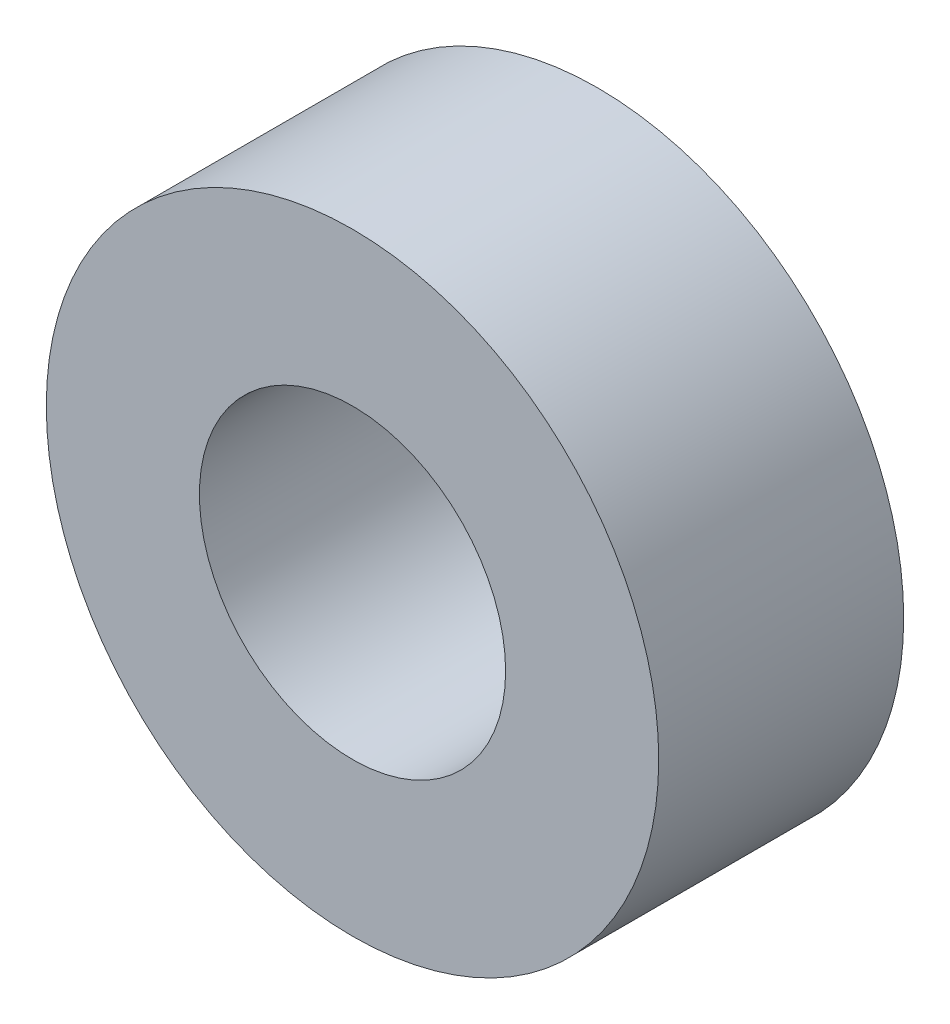
ISO-10303-21;
HEADER;
FILE_DESCRIPTION(('STEP AP214'),'2;1');
FILE_NAME('part.step','',(''),(''),'','','');
FILE_SCHEMA(('AUTOMOTIVE_DESIGN { 1 0 10303 214 1 1 1 1 }'));
ENDSEC;
DATA;
#1=APPLICATION_CONTEXT('core data for automotive mechanical design processes');
#2=APPLICATION_PROTOCOL_DEFINITION('international standard','automotive_design',2000,#1);
#3=PRODUCT_CONTEXT('',#1,'mechanical');
#4=PRODUCT('Part','Part','',(#3));
#5=PRODUCT_RELATED_PRODUCT_CATEGORY('part','',(#4));
#6=PRODUCT_DEFINITION_FORMATION('','',#4);
#7=PRODUCT_DEFINITION_CONTEXT('part definition',#1,'design');
#8=PRODUCT_DEFINITION('design','',#6,#7);
#9=PRODUCT_DEFINITION_SHAPE('','',#8);
#10=(LENGTH_UNIT() NAMED_UNIT(*) SI_UNIT(.MILLI.,.METRE.));
#11=(NAMED_UNIT(*) PLANE_ANGLE_UNIT() SI_UNIT($,.RADIAN.));
#12=(NAMED_UNIT(*) SI_UNIT($,.STERADIAN.) SOLID_ANGLE_UNIT());
#13=UNCERTAINTY_MEASURE_WITH_UNIT(LENGTH_MEASURE(1.E-05),#10,'distance_accuracy_value','');
#14=(GEOMETRIC_REPRESENTATION_CONTEXT(3) GLOBAL_UNCERTAINTY_ASSIGNED_CONTEXT((#13)) GLOBAL_UNIT_ASSIGNED_CONTEXT((#10,
#11,#12)) REPRESENTATION_CONTEXT('',''));
#15=CARTESIAN_POINT('',(0.,0.,0.));
#16=DIRECTION('',(0.,0.,1.));
#17=DIRECTION('',(1.,0.,0.));
#18=AXIS2_PLACEMENT_3D('',#15,#16,#17);
#19=CARTESIAN_POINT('',(0.,0.,4.));
#20=DIRECTION('',(0.,0.,1.));
#21=DIRECTION('',(1.,0.,0.));
#22=AXIS2_PLACEMENT_3D('',#19,#20,#21);
#23=PLANE('',#22);
#24=CARTESIAN_POINT('',(0.,0.,4.));
#25=DIRECTION('',(0.,0.,1.));
#26=DIRECTION('',(1.,0.,0.));
#27=AXIS2_PLACEMENT_3D('',#24,#25,#26);
#28=CIRCLE('',#27,5.);
#29=CARTESIAN_POINT('',(5.,0.,4.));
#30=VERTEX_POINT('',#29);
#31=EDGE_CURVE('E10',#30,#30,#28,.T.);
#32=ORIENTED_EDGE('',*,*,#31,.T.);
#33=EDGE_LOOP('',(#32));
#34=FACE_BOUND('',#33,.T.);
#35=CARTESIAN_POINT('',(0.,0.,4.));
#36=DIRECTION('',(0.,0.,1.));
#37=DIRECTION('',(1.,0.,0.));
#38=AXIS2_PLACEMENT_3D('',#35,#36,#37);
#39=CIRCLE('',#38,2.5);
#40=CARTESIAN_POINT('',(2.5,0.,4.));
#41=VERTEX_POINT('',#40);
#42=EDGE_CURVE('E50',#41,#41,#39,.T.);
#43=ORIENTED_EDGE('',*,*,#42,.F.);
#44=EDGE_LOOP('',(#43));
#45=FACE_BOUND('',#44,.T.);
#46=ADVANCED_FACE('F39',(#34,#45),#23,.T.);
#47=CARTESIAN_POINT('',(0.,0.,0.));
#48=DIRECTION('',(0.,0.,1.));
#49=DIRECTION('',(1.,0.,0.));
#50=AXIS2_PLACEMENT_3D('',#47,#48,#49);
#51=PLANE('',#50);
#52=CARTESIAN_POINT('',(0.,0.,0.));
#53=DIRECTION('',(0.,0.,1.));
#54=DIRECTION('',(1.,0.,0.));
#55=AXIS2_PLACEMENT_3D('',#52,#53,#54);
#56=CIRCLE('',#55,5.);
#57=CARTESIAN_POINT('',(5.,0.,0.));
#58=VERTEX_POINT('',#57);
#59=EDGE_CURVE('E43',#58,#58,#56,.T.);
#60=ORIENTED_EDGE('',*,*,#59,.F.);
#61=EDGE_LOOP('',(#60));
#62=FACE_BOUND('',#61,.T.);
#63=CARTESIAN_POINT('',(0.,0.,0.));
#64=DIRECTION('',(0.,0.,1.));
#65=DIRECTION('',(1.,0.,0.));
#66=AXIS2_PLACEMENT_3D('',#63,#64,#65);
#67=CIRCLE('',#66,2.5);
#68=CARTESIAN_POINT('',(2.5,0.,0.));
#69=VERTEX_POINT('',#68);
#70=EDGE_CURVE('E52',#69,#69,#67,.T.);
#71=ORIENTED_EDGE('',*,*,#70,.T.);
#72=EDGE_LOOP('',(#71));
#73=FACE_BOUND('',#72,.T.);
#74=ADVANCED_FACE('F62',(#62,#73),#51,.F.);
#75=CARTESIAN_POINT('',(0.,0.,4.));
#76=DIRECTION('',(0.,0.,-1.));
#77=DIRECTION('',(-1.,0.,0.));
#78=AXIS2_PLACEMENT_3D('',#75,#76,#77);
#79=CYLINDRICAL_SURFACE('',#78,5.);
#80=ORIENTED_EDGE('',*,*,#31,.F.);
#81=EDGE_LOOP('',(#80));
#82=FACE_BOUND('',#81,.T.);
#83=ORIENTED_EDGE('',*,*,#59,.T.);
#84=EDGE_LOOP('',(#83));
#85=FACE_BOUND('',#84,.T.);
#86=ADVANCED_FACE('F41',(#82,#85),#79,.T.);
#87=CARTESIAN_POINT('',(0.,0.,4.));
#88=DIRECTION('',(0.,0.,-1.));
#89=DIRECTION('',(-1.,0.,0.));
#90=AXIS2_PLACEMENT_3D('',#87,#88,#89);
#91=CYLINDRICAL_SURFACE('',#90,2.5);
#92=ORIENTED_EDGE('',*,*,#42,.T.);
#93=EDGE_LOOP('',(#92));
#94=FACE_BOUND('',#93,.T.);
#95=ORIENTED_EDGE('',*,*,#70,.F.);
#96=EDGE_LOOP('',(#95));
#97=FACE_BOUND('',#96,.T.);
#98=ADVANCED_FACE('F58',(#94,#97),#91,.F.);
#99=CLOSED_SHELL('',(#46,#74,#86,#98));
#100=MANIFOLD_SOLID_BREP('B2',#99);
#101=ADVANCED_BREP_SHAPE_REPRESENTATION('',(#18,#100),#14);
#102=SHAPE_DEFINITION_REPRESENTATION(#9,#101);
ENDSEC;
END-ISO-10303-21;
